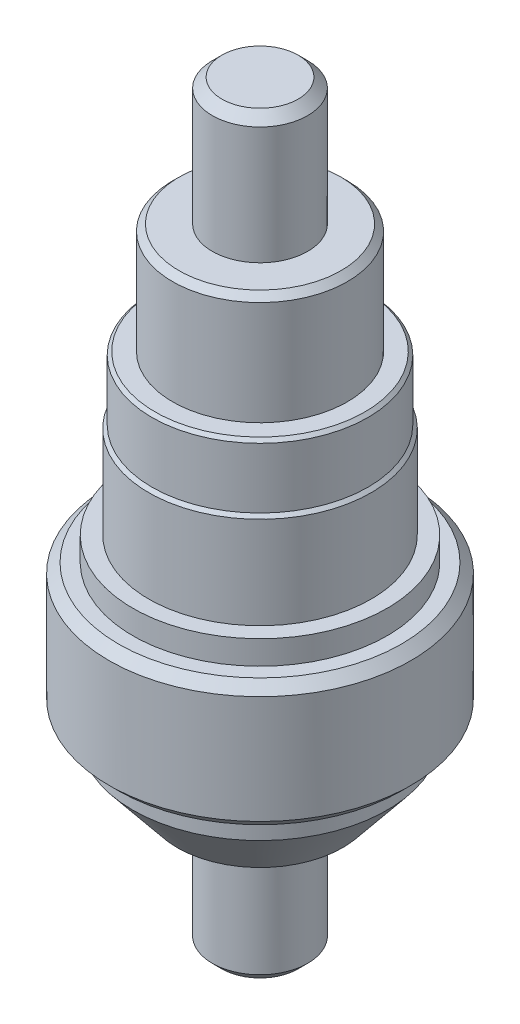
ISO-10303-21;
HEADER;
FILE_DESCRIPTION(('STEP AP214'),'2;1');
FILE_NAME('part.step','',(''),(''),'','','');
FILE_SCHEMA(('AUTOMOTIVE_DESIGN { 1 0 10303 214 1 1 1 1 }'));
ENDSEC;
DATA;
#1=APPLICATION_CONTEXT('core data for automotive mechanical design processes');
#2=APPLICATION_PROTOCOL_DEFINITION('international standard','automotive_design',2000,#1);
#3=PRODUCT_CONTEXT('',#1,'mechanical');
#4=PRODUCT('Part','Part','',(#3));
#5=PRODUCT_RELATED_PRODUCT_CATEGORY('part','',(#4));
#6=PRODUCT_DEFINITION_FORMATION('','',#4);
#7=PRODUCT_DEFINITION_CONTEXT('part definition',#1,'design');
#8=PRODUCT_DEFINITION('design','',#6,#7);
#9=PRODUCT_DEFINITION_SHAPE('','',#8);
#10=(LENGTH_UNIT() NAMED_UNIT(*) SI_UNIT(.MILLI.,.METRE.));
#11=(NAMED_UNIT(*) PLANE_ANGLE_UNIT() SI_UNIT($,.RADIAN.));
#12=(NAMED_UNIT(*) SI_UNIT($,.STERADIAN.) SOLID_ANGLE_UNIT());
#13=UNCERTAINTY_MEASURE_WITH_UNIT(LENGTH_MEASURE(1.E-05),#10,'distance_accuracy_value','');
#14=(GEOMETRIC_REPRESENTATION_CONTEXT(3) GLOBAL_UNCERTAINTY_ASSIGNED_CONTEXT((#13)) GLOBAL_UNIT_ASSIGNED_CONTEXT((#10,
#11,#12)) REPRESENTATION_CONTEXT('',''));
#15=CARTESIAN_POINT('',(0.,0.,0.));
#16=DIRECTION('',(0.,0.,1.));
#17=DIRECTION('',(1.,0.,0.));
#18=AXIS2_PLACEMENT_3D('',#15,#16,#17);
#19=CARTESIAN_POINT('',(1.50000000000001,15.225,0.));
#20=DIRECTION('',(0.,1.,0.));
#21=DIRECTION('',(0.,0.,1.));
#22=AXIS2_PLACEMENT_3D('',#19,#20,#21);
#23=PLANE('',#22);
#24=CARTESIAN_POINT('',(0.,15.2249999999867,0.));
#25=DIRECTION('',(0.,-1.,0.));
#26=DIRECTION('',(0.,0.,-1.));
#27=AXIS2_PLACEMENT_3D('',#24,#25,#26);
#28=CIRCLE('',#27,1.20000000003984);
#29=CARTESIAN_POINT('',(0.,15.2249999999867,-1.20000000003984));
#30=VERTEX_POINT('',#29);
#31=EDGE_CURVE('E17',#30,#30,#28,.T.);
#32=ORIENTED_EDGE('',*,*,#31,.F.);
#33=EDGE_LOOP('',(#32));
#34=FACE_BOUND('',#33,.T.);
#35=ADVANCED_FACE('F14',(#34),#23,.T.);
#36=CARTESIAN_POINT('',(0.,14.925000000062,0.));
#37=DIRECTION('',(0.,-1.,0.));
#38=DIRECTION('',(0.,0.,-1.));
#39=AXIS2_PLACEMENT_3D('',#36,#37,#38);
#40=CONICAL_SURFACE('',#39,1.49999999996453,0.785398163397448);
#41=ORIENTED_EDGE('',*,*,#31,.T.);
#42=EDGE_LOOP('',(#41));
#43=FACE_BOUND('',#42,.T.);
#44=CARTESIAN_POINT('',(0.,14.925,0.));
#45=DIRECTION('',(0.,-1.,0.));
#46=DIRECTION('',(0.,0.,-1.));
#47=AXIS2_PLACEMENT_3D('',#44,#45,#46);
#48=CIRCLE('',#47,1.50000000000002);
#49=CARTESIAN_POINT('',(0.,14.925,-1.50000000000002));
#50=VERTEX_POINT('',#49);
#51=EDGE_CURVE('E64',#50,#50,#48,.T.);
#52=ORIENTED_EDGE('',*,*,#51,.F.);
#53=EDGE_LOOP('',(#52));
#54=FACE_BOUND('',#53,.T.);
#55=ADVANCED_FACE('F116',(#43,#54),#40,.T.);
#56=CARTESIAN_POINT('',(0.,13.225,0.));
#57=DIRECTION('',(0.,-1.,0.));
#58=DIRECTION('',(0.,0.,-1.));
#59=AXIS2_PLACEMENT_3D('',#56,#57,#58);
#60=CYLINDRICAL_SURFACE('',#59,1.50000000000002);
#61=ORIENTED_EDGE('',*,*,#51,.T.);
#62=EDGE_LOOP('',(#61));
#63=FACE_BOUND('',#62,.T.);
#64=CARTESIAN_POINT('',(0.,11.225,0.));
#65=DIRECTION('',(0.,-1.,0.));
#66=DIRECTION('',(0.,0.,-1.));
#67=AXIS2_PLACEMENT_3D('',#64,#65,#66);
#68=CIRCLE('',#67,1.50000000000002);
#69=CARTESIAN_POINT('',(0.,11.225,-1.50000000000002));
#70=VERTEX_POINT('',#69);
#71=EDGE_CURVE('E68',#70,#70,#68,.T.);
#72=ORIENTED_EDGE('',*,*,#71,.F.);
#73=EDGE_LOOP('',(#72));
#74=FACE_BOUND('',#73,.T.);
#75=ADVANCED_FACE('F114',(#63,#74),#60,.T.);
#76=CARTESIAN_POINT('',(2.75000000000001,11.225,0.));
#77=DIRECTION('',(0.,1.,0.));
#78=DIRECTION('',(0.,0.,1.));
#79=AXIS2_PLACEMENT_3D('',#76,#77,#78);
#80=PLANE('',#79);
#81=ORIENTED_EDGE('',*,*,#71,.T.);
#82=EDGE_LOOP('',(#81));
#83=FACE_BOUND('',#82,.T.);
#84=CARTESIAN_POINT('',(0.,11.2250000000245,0.));
#85=DIRECTION('',(0.,-1.,0.));
#86=DIRECTION('',(0.,0.,-1.));
#87=AXIS2_PLACEMENT_3D('',#84,#85,#86);
#88=CIRCLE('',#87,2.55000000009886);
#89=CARTESIAN_POINT('',(0.,11.2250000000245,-2.55000000009886));
#90=VERTEX_POINT('',#89);
#91=EDGE_CURVE('E63',#90,#90,#88,.T.);
#92=ORIENTED_EDGE('',*,*,#91,.F.);
#93=EDGE_LOOP('',(#92));
#94=FACE_BOUND('',#93,.T.);
#95=ADVANCED_FACE('F111',(#83,#94),#80,.T.);
#96=CARTESIAN_POINT('',(0.,11.0250000000747,0.));
#97=DIRECTION('',(0.,-1.,0.));
#98=DIRECTION('',(0.,0.,-1.));
#99=AXIS2_PLACEMENT_3D('',#96,#97,#98);
#100=CONICAL_SURFACE('',#99,2.75000000004866,0.785398163397448);
#101=ORIENTED_EDGE('',*,*,#91,.T.);
#102=EDGE_LOOP('',(#101));
#103=FACE_BOUND('',#102,.T.);
#104=CARTESIAN_POINT('',(0.,11.025,0.));
#105=DIRECTION('',(0.,-1.,0.));
#106=DIRECTION('',(0.,0.,-1.));
#107=AXIS2_PLACEMENT_3D('',#104,#105,#106);
#108=CIRCLE('',#107,2.75000000000001);
#109=CARTESIAN_POINT('',(0.,11.025,-2.75000000000001));
#110=VERTEX_POINT('',#109);
#111=EDGE_CURVE('E58',#110,#110,#108,.T.);
#112=ORIENTED_EDGE('',*,*,#111,.F.);
#113=EDGE_LOOP('',(#112));
#114=FACE_BOUND('',#113,.T.);
#115=ADVANCED_FACE('F124',(#103,#114),#100,.T.);
#116=CARTESIAN_POINT('',(0.,9.4875,0.));
#117=DIRECTION('',(0.,-1.,0.));
#118=DIRECTION('',(0.,0.,-1.));
#119=AXIS2_PLACEMENT_3D('',#116,#117,#118);
#120=CYLINDRICAL_SURFACE('',#119,2.75000000000001);
#121=ORIENTED_EDGE('',*,*,#111,.T.);
#122=EDGE_LOOP('',(#121));
#123=FACE_BOUND('',#122,.T.);
#124=CARTESIAN_POINT('',(0.,7.75,0.));
#125=DIRECTION('',(0.,-1.,0.));
#126=DIRECTION('',(0.,0.,-1.));
#127=AXIS2_PLACEMENT_3D('',#124,#125,#126);
#128=CIRCLE('',#127,2.75000000000001);
#129=CARTESIAN_POINT('',(0.,7.75,-2.75000000000001));
#130=VERTEX_POINT('',#129);
#131=EDGE_CURVE('E62',#130,#130,#128,.T.);
#132=ORIENTED_EDGE('',*,*,#131,.F.);
#133=EDGE_LOOP('',(#132));
#134=FACE_BOUND('',#133,.T.);
#135=ADVANCED_FACE('F201',(#123,#134),#120,.T.);
#136=CARTESIAN_POINT('',(3.4,7.75,0.));
#137=DIRECTION('',(0.,1.,0.));
#138=DIRECTION('',(0.,0.,1.));
#139=AXIS2_PLACEMENT_3D('',#136,#137,#138);
#140=PLANE('',#139);
#141=ORIENTED_EDGE('',*,*,#131,.T.);
#142=EDGE_LOOP('',(#141));
#143=FACE_BOUND('',#142,.T.);
#144=CARTESIAN_POINT('',(0.,7.75000000004411,0.));
#145=DIRECTION('',(0.,-1.,0.));
#146=DIRECTION('',(0.,0.,-1.));
#147=AXIS2_PLACEMENT_3D('',#144,#145,#146);
#148=CIRCLE('',#147,3.30000000008113);
#149=CARTESIAN_POINT('',(0.,7.75000000004411,-3.30000000008113));
#150=VERTEX_POINT('',#149);
#151=EDGE_CURVE('E57',#150,#150,#148,.T.);
#152=ORIENTED_EDGE('',*,*,#151,.F.);
#153=EDGE_LOOP('',(#152));
#154=FACE_BOUND('',#153,.T.);
#155=ADVANCED_FACE('F197',(#143,#154),#140,.T.);
#156=CARTESIAN_POINT('',(0.,7.65000000001237,0.));
#157=DIRECTION('',(0.,-1.,0.));
#158=DIRECTION('',(0.,0.,-1.));
#159=AXIS2_PLACEMENT_3D('',#156,#157,#158);
#160=CONICAL_SURFACE('',#159,3.40000000011287,0.785398163397448);
#161=ORIENTED_EDGE('',*,*,#151,.T.);
#162=EDGE_LOOP('',(#161));
#163=FACE_BOUND('',#162,.T.);
#164=CARTESIAN_POINT('',(0.,7.65,0.));
#165=DIRECTION('',(0.,-1.,0.));
#166=DIRECTION('',(0.,0.,-1.));
#167=AXIS2_PLACEMENT_3D('',#164,#165,#166);
#168=CIRCLE('',#167,3.4);
#169=CARTESIAN_POINT('',(0.,7.65,-3.4));
#170=VERTEX_POINT('',#169);
#171=EDGE_CURVE('E53',#170,#170,#168,.T.);
#172=ORIENTED_EDGE('',*,*,#171,.F.);
#173=EDGE_LOOP('',(#172));
#174=FACE_BOUND('',#173,.T.);
#175=ADVANCED_FACE('F193',(#163,#174),#160,.T.);
#176=CARTESIAN_POINT('',(0.,-8.475,0.));
#177=DIRECTION('',(0.,-1.,0.));
#178=DIRECTION('',(0.,0.,-1.));
#179=AXIS2_PLACEMENT_3D('',#176,#177,#178);
#180=PLANE('',#179);
#181=CARTESIAN_POINT('',(0.,-8.47500000008949,0.));
#182=DIRECTION('',(0.,1.,0.));
#183=DIRECTION('',(0.,0.,1.));
#184=AXIS2_PLACEMENT_3D('',#181,#182,#183);
#185=CIRCLE('',#184,1.19999999992615);
#186=CARTESIAN_POINT('',(0.,-8.47500000008949,1.19999999992615));
#187=VERTEX_POINT('',#186);
#188=EDGE_CURVE('E52',#187,#187,#185,.T.);
#189=ORIENTED_EDGE('',*,*,#188,.F.);
#190=EDGE_LOOP('',(#189));
#191=FACE_BOUND('',#190,.T.);
#192=ADVANCED_FACE('F189',(#191),#180,.T.);
#193=CARTESIAN_POINT('',(0.,6.75,0.));
#194=DIRECTION('',(0.,-1.,0.));
#195=DIRECTION('',(0.,0.,-1.));
#196=AXIS2_PLACEMENT_3D('',#193,#194,#195);
#197=CYLINDRICAL_SURFACE('',#196,3.4);
#198=ORIENTED_EDGE('',*,*,#171,.T.);
#199=EDGE_LOOP('',(#198));
#200=FACE_BOUND('',#199,.T.);
#201=CARTESIAN_POINT('',(0.,5.74999999997772,0.));
#202=DIRECTION('',(0.,-1.,0.));
#203=DIRECTION('',(0.,0.,-1.));
#204=AXIS2_PLACEMENT_3D('',#201,#202,#203);
#205=CIRCLE('',#204,3.39999999994234);
#206=CARTESIAN_POINT('',(0.,5.74999999997772,-3.39999999994234));
#207=VERTEX_POINT('',#206);
#208=EDGE_CURVE('E48',#207,#207,#205,.T.);
#209=ORIENTED_EDGE('',*,*,#208,.F.);
#210=EDGE_LOOP('',(#209));
#211=FACE_BOUND('',#210,.T.);
#212=ADVANCED_FACE('F185',(#200,#211),#197,.T.);
#213=CARTESIAN_POINT('',(0.,-8.17500000010796,0.));
#214=DIRECTION('',(0.,1.,0.));
#215=DIRECTION('',(0.,0.,1.));
#216=AXIS2_PLACEMENT_3D('',#213,#214,#215);
#217=CONICAL_SURFACE('',#216,1.49999999990769,0.785398163397448);
#218=CARTESIAN_POINT('',(0.,-8.17500000000001,0.));
#219=DIRECTION('',(0.,-1.,0.));
#220=DIRECTION('',(0.,0.,-1.));
#221=AXIS2_PLACEMENT_3D('',#218,#219,#220);
#222=CIRCLE('',#221,1.5);
#223=CARTESIAN_POINT('',(0.,-8.17500000000001,-1.5));
#224=VERTEX_POINT('',#223);
#225=EDGE_CURVE('E44',#224,#224,#222,.F.);
#226=ORIENTED_EDGE('',*,*,#225,.F.);
#227=EDGE_LOOP('',(#226));
#228=FACE_BOUND('',#227,.T.);
#229=ORIENTED_EDGE('',*,*,#188,.T.);
#230=EDGE_LOOP('',(#229));
#231=FACE_BOUND('',#230,.T.);
#232=ADVANCED_FACE('F181',(#228,#231),#217,.T.);
#233=CARTESIAN_POINT('',(0.,5.65000000011651,0.));
#234=DIRECTION('',(0.,-1.,0.));
#235=DIRECTION('',(0.,0.,-1.));
#236=AXIS2_PLACEMENT_3D('',#233,#234,#235);
#237=CONICAL_SURFACE('',#236,3.49999999997408,0.7853981642501);
#238=ORIENTED_EDGE('',*,*,#208,.T.);
#239=EDGE_LOOP('',(#238));
#240=FACE_BOUND('',#239,.T.);
#241=CARTESIAN_POINT('',(0.,5.65,0.));
#242=DIRECTION('',(0.,-1.,0.));
#243=DIRECTION('',(0.,0.,-1.));
#244=AXIS2_PLACEMENT_3D('',#241,#242,#243);
#245=CIRCLE('',#244,3.5);
#246=CARTESIAN_POINT('',(0.,5.65,-3.5));
#247=VERTEX_POINT('',#246);
#248=EDGE_CURVE('E39',#247,#247,#245,.T.);
#249=ORIENTED_EDGE('',*,*,#248,.F.);
#250=EDGE_LOOP('',(#249));
#251=FACE_BOUND('',#250,.T.);
#252=ADVANCED_FACE('F177',(#240,#251),#237,.T.);
#253=CARTESIAN_POINT('',(0.,-6.475,0.));
#254=DIRECTION('',(0.,-1.,0.));
#255=DIRECTION('',(0.,0.,-1.));
#256=AXIS2_PLACEMENT_3D('',#253,#254,#255);
#257=CYLINDRICAL_SURFACE('',#256,1.5);
#258=ORIENTED_EDGE('',*,*,#225,.T.);
#259=EDGE_LOOP('',(#258));
#260=FACE_BOUND('',#259,.T.);
#261=CARTESIAN_POINT('',(0.,-4.475,0.));
#262=DIRECTION('',(0.,-1.,0.));
#263=DIRECTION('',(0.,0.,-1.));
#264=AXIS2_PLACEMENT_3D('',#261,#262,#263);
#265=CIRCLE('',#264,1.5);
#266=CARTESIAN_POINT('',(0.,-4.475,-1.5));
#267=VERTEX_POINT('',#266);
#268=EDGE_CURVE('E43',#267,#267,#265,.F.);
#269=ORIENTED_EDGE('',*,*,#268,.F.);
#270=EDGE_LOOP('',(#269));
#271=FACE_BOUND('',#270,.T.);
#272=ADVANCED_FACE('F173',(#260,#271),#257,.T.);
#273=CARTESIAN_POINT('',(0.,4.25,0.));
#274=DIRECTION('',(0.,-1.,0.));
#275=DIRECTION('',(0.,0.,-1.));
#276=AXIS2_PLACEMENT_3D('',#273,#274,#275);
#277=CYLINDRICAL_SURFACE('',#276,3.5);
#278=ORIENTED_EDGE('',*,*,#248,.T.);
#279=EDGE_LOOP('',(#278));
#280=FACE_BOUND('',#279,.T.);
#281=CARTESIAN_POINT('',(0.,2.75,0.));
#282=DIRECTION('',(0.,-1.,0.));
#283=DIRECTION('',(0.,0.,-1.));
#284=AXIS2_PLACEMENT_3D('',#281,#282,#283);
#285=CIRCLE('',#284,3.5);
#286=CARTESIAN_POINT('',(0.,2.75,-3.5));
#287=VERTEX_POINT('',#286);
#288=EDGE_CURVE('E89',#287,#287,#285,.T.);
#289=ORIENTED_EDGE('',*,*,#288,.F.);
#290=EDGE_LOOP('',(#289));
#291=FACE_BOUND('',#290,.T.);
#292=ADVANCED_FACE('F169',(#280,#291),#277,.T.);
#293=CARTESIAN_POINT('',(1.5,-4.475,0.));
#294=DIRECTION('',(0.,-1.,0.));
#295=DIRECTION('',(0.,0.,-1.));
#296=AXIS2_PLACEMENT_3D('',#293,#294,#295);
#297=PLANE('',#296);
#298=ORIENTED_EDGE('',*,*,#268,.T.);
#299=EDGE_LOOP('',(#298));
#300=FACE_BOUND('',#299,.T.);
#301=CARTESIAN_POINT('',(0.,-4.47499999995671,0.));
#302=DIRECTION('',(0.,1.,0.));
#303=DIRECTION('',(0.,0.,1.));
#304=AXIS2_PLACEMENT_3D('',#301,#302,#303);
#305=CIRCLE('',#304,2.59999999997262);
#306=CARTESIAN_POINT('',(0.,-4.47499999995671,2.59999999997262));
#307=VERTEX_POINT('',#306);
#308=EDGE_CURVE('E85',#307,#307,#305,.T.);
#309=ORIENTED_EDGE('',*,*,#308,.F.);
#310=EDGE_LOOP('',(#309));
#311=FACE_BOUND('',#310,.T.);
#312=ADVANCED_FACE('F165',(#300,#311),#297,.T.);
#313=CARTESIAN_POINT('',(4.,2.75,0.));
#314=DIRECTION('',(0.,1.,0.));
#315=DIRECTION('',(0.,0.,1.));
#316=AXIS2_PLACEMENT_3D('',#313,#314,#315);
#317=PLANE('',#316);
#318=ORIENTED_EDGE('',*,*,#288,.T.);
#319=EDGE_LOOP('',(#318));
#320=FACE_BOUND('',#319,.T.);
#321=CARTESIAN_POINT('',(0.,2.75,0.));
#322=DIRECTION('',(0.,-1.,0.));
#323=DIRECTION('',(0.,0.,-1.));
#324=AXIS2_PLACEMENT_3D('',#321,#322,#323);
#325=CIRCLE('',#324,4.);
#326=CARTESIAN_POINT('',(0.,2.75,-4.));
#327=VERTEX_POINT('',#326);
#328=EDGE_CURVE('E38',#327,#327,#325,.T.);
#329=ORIENTED_EDGE('',*,*,#328,.F.);
#330=EDGE_LOOP('',(#329));
#331=FACE_BOUND('',#330,.T.);
#332=ADVANCED_FACE('F161',(#320,#331),#317,.T.);
#333=CARTESIAN_POINT('',(0.,-2.74999999999181,0.));
#334=DIRECTION('',(0.,1.,0.));
#335=DIRECTION('',(0.,0.,1.));
#336=AXIS2_PLACEMENT_3D('',#333,#334,#335);
#337=CONICAL_SURFACE('',#336,3.99999999996226,0.681770703406911);
#338=CARTESIAN_POINT('',(0.,-2.75,0.));
#339=DIRECTION('',(0.,-1.,0.));
#340=DIRECTION('',(0.,0.,-1.));
#341=AXIS2_PLACEMENT_3D('',#338,#339,#340);
#342=CIRCLE('',#341,4.);
#343=CARTESIAN_POINT('',(0.,-2.75,-4.));
#344=VERTEX_POINT('',#343);
#345=EDGE_CURVE('E33',#344,#344,#342,.F.);
#346=ORIENTED_EDGE('',*,*,#345,.F.);
#347=EDGE_LOOP('',(#346));
#348=FACE_BOUND('',#347,.T.);
#349=ORIENTED_EDGE('',*,*,#308,.T.);
#350=EDGE_LOOP('',(#349));
#351=FACE_BOUND('',#350,.T.);
#352=ADVANCED_FACE('F157',(#348,#351),#337,.T.);
#353=CARTESIAN_POINT('',(0.,2.375,0.));
#354=DIRECTION('',(0.,-1.,0.));
#355=DIRECTION('',(0.,0.,-1.));
#356=AXIS2_PLACEMENT_3D('',#353,#354,#355);
#357=CYLINDRICAL_SURFACE('',#356,4.);
#358=ORIENTED_EDGE('',*,*,#328,.T.);
#359=EDGE_LOOP('',(#358));
#360=FACE_BOUND('',#359,.T.);
#361=CARTESIAN_POINT('',(0.,2.,0.));
#362=DIRECTION('',(0.,-1.,0.));
#363=DIRECTION('',(0.,0.,-1.));
#364=AXIS2_PLACEMENT_3D('',#361,#362,#363);
#365=CIRCLE('',#364,4.);
#366=CARTESIAN_POINT('',(0.,2.,-4.));
#367=VERTEX_POINT('',#366);
#368=EDGE_CURVE('E37',#367,#367,#365,.T.);
#369=ORIENTED_EDGE('',*,*,#368,.F.);
#370=EDGE_LOOP('',(#369));
#371=FACE_BOUND('',#370,.T.);
#372=ADVANCED_FACE('F153',(#360,#371),#357,.T.);
#373=CARTESIAN_POINT('',(0.,-2.375,0.));
#374=DIRECTION('',(0.,-1.,0.));
#375=DIRECTION('',(0.,0.,-1.));
#376=AXIS2_PLACEMENT_3D('',#373,#374,#375);
#377=CYLINDRICAL_SURFACE('',#376,4.);
#378=ORIENTED_EDGE('',*,*,#345,.T.);
#379=EDGE_LOOP('',(#378));
#380=FACE_BOUND('',#379,.T.);
#381=CARTESIAN_POINT('',(0.,-2.,0.));
#382=DIRECTION('',(0.,-1.,0.));
#383=DIRECTION('',(0.,0.,-1.));
#384=AXIS2_PLACEMENT_3D('',#381,#382,#383);
#385=CIRCLE('',#384,4.);
#386=CARTESIAN_POINT('',(0.,-2.,-4.));
#387=VERTEX_POINT('',#386);
#388=EDGE_CURVE('E75',#387,#387,#385,.F.);
#389=ORIENTED_EDGE('',*,*,#388,.F.);
#390=EDGE_LOOP('',(#389));
#391=FACE_BOUND('',#390,.T.);
#392=ADVANCED_FACE('F149',(#380,#391),#377,.T.);
#393=CARTESIAN_POINT('',(4.75,2.,0.));
#394=DIRECTION('',(0.,1.,0.));
#395=DIRECTION('',(0.,0.,1.));
#396=AXIS2_PLACEMENT_3D('',#393,#394,#395);
#397=PLANE('',#396);
#398=ORIENTED_EDGE('',*,*,#368,.T.);
#399=EDGE_LOOP('',(#398));
#400=FACE_BOUND('',#399,.T.);
#401=CARTESIAN_POINT('',(0.,1.99999999995271,0.));
#402=DIRECTION('',(0.,-1.,0.));
#403=DIRECTION('',(0.,0.,-1.));
#404=AXIS2_PLACEMENT_3D('',#401,#402,#403);
#405=CIRCLE('',#404,4.45000000001983);
#406=CARTESIAN_POINT('',(0.,1.99999999995271,-4.45000000001983));
#407=VERTEX_POINT('',#406);
#408=EDGE_CURVE('E71',#407,#407,#405,.T.);
#409=ORIENTED_EDGE('',*,*,#408,.F.);
#410=EDGE_LOOP('',(#409));
#411=FACE_BOUND('',#410,.T.);
#412=ADVANCED_FACE('F145',(#400,#411),#397,.T.);
#413=CARTESIAN_POINT('',(4.,-2.,0.));
#414=DIRECTION('',(0.,-1.,0.));
#415=DIRECTION('',(0.,0.,-1.));
#416=AXIS2_PLACEMENT_3D('',#413,#414,#415);
#417=PLANE('',#416);
#418=ORIENTED_EDGE('',*,*,#388,.T.);
#419=EDGE_LOOP('',(#418));
#420=FACE_BOUND('',#419,.T.);
#421=CARTESIAN_POINT('',(0.,-2.00000000006639,0.));
#422=DIRECTION('',(0.,1.,0.));
#423=DIRECTION('',(-1.,0.,0.));
#424=AXIS2_PLACEMENT_3D('',#421,#422,#423);
#425=CIRCLE('',#424,4.44999999996298);
#426=CARTESIAN_POINT('',(-4.44999999996298,-2.00000000006639,0.));
#427=VERTEX_POINT('',#426);
#428=EDGE_CURVE('E30',#427,#427,#425,.T.);
#429=ORIENTED_EDGE('',*,*,#428,.F.);
#430=EDGE_LOOP('',(#429));
#431=FACE_BOUND('',#430,.T.);
#432=ADVANCED_FACE('F141',(#420,#431),#417,.T.);
#433=CARTESIAN_POINT('',(0.,1.6999999992322,0.));
#434=DIRECTION('',(0.,-1.,0.));
#435=DIRECTION('',(0.,0.,-1.));
#436=AXIS2_PLACEMENT_3D('',#433,#434,#435);
#437=CONICAL_SURFACE('',#436,4.75000000074033,0.785398163397448);
#438=CARTESIAN_POINT('',(0.,1.69999999917536,0.));
#439=DIRECTION('',(0.,-1.,0.));
#440=DIRECTION('',(0.,0.,-1.));
#441=AXIS2_PLACEMENT_3D('',#438,#439,#440);
#442=CIRCLE('',#441,4.75);
#443=CARTESIAN_POINT('',(0.,1.69999999917536,-4.75));
#444=VERTEX_POINT('',#443);
#445=EDGE_CURVE('E22',#444,#444,#442,.T.);
#446=ORIENTED_EDGE('',*,*,#445,.F.);
#447=EDGE_LOOP('',(#446));
#448=FACE_BOUND('',#447,.T.);
#449=ORIENTED_EDGE('',*,*,#408,.T.);
#450=EDGE_LOOP('',(#449));
#451=FACE_BOUND('',#450,.T.);
#452=ADVANCED_FACE('F134',(#448,#451),#437,.T.);
#453=CARTESIAN_POINT('',(0.,-1.70000000002801,0.));
#454=DIRECTION('',(0.,1.,0.));
#455=DIRECTION('',(-1.,0.,0.));
#456=AXIS2_PLACEMENT_3D('',#453,#454,#455);
#457=CONICAL_SURFACE('',#456,4.75000000000136,0.785398163397448);
#458=CARTESIAN_POINT('',(0.,-1.7,0.));
#459=DIRECTION('',(0.,-1.,0.));
#460=DIRECTION('',(0.,0.,-1.));
#461=AXIS2_PLACEMENT_3D('',#458,#459,#460);
#462=CIRCLE('',#461,4.75);
#463=CARTESIAN_POINT('',(0.,-1.7,-4.75));
#464=VERTEX_POINT('',#463);
#465=EDGE_CURVE('E10',#464,#464,#462,.F.);
#466=ORIENTED_EDGE('',*,*,#465,.F.);
#467=EDGE_LOOP('',(#466));
#468=FACE_BOUND('',#467,.T.);
#469=ORIENTED_EDGE('',*,*,#428,.T.);
#470=EDGE_LOOP('',(#469));
#471=FACE_BOUND('',#470,.T.);
#472=ADVANCED_FACE('F129',(#468,#471),#457,.T.);
#473=CARTESIAN_POINT('',(0.,0.,0.));
#474=DIRECTION('',(0.,-1.,0.));
#475=DIRECTION('',(0.,0.,-1.));
#476=AXIS2_PLACEMENT_3D('',#473,#474,#475);
#477=CYLINDRICAL_SURFACE('',#476,4.75);
#478=ORIENTED_EDGE('',*,*,#465,.T.);
#479=EDGE_LOOP('',(#478));
#480=FACE_BOUND('',#479,.T.);
#481=ORIENTED_EDGE('',*,*,#445,.T.);
#482=EDGE_LOOP('',(#481));
#483=FACE_BOUND('',#482,.T.);
#484=ADVANCED_FACE('F127',(#480,#483),#477,.T.);
#485=CLOSED_SHELL('',(#35,#55,#75,#95,#115,#135,#155,#175,#192,#212,#232,#252,#272,#292,#312,
#332,#352,#372,#392,#412,#432,#452,#472,#484));
#486=MANIFOLD_SOLID_BREP('B1',#485);
#487=ADVANCED_BREP_SHAPE_REPRESENTATION('',(#18,#486),#14);
#488=SHAPE_DEFINITION_REPRESENTATION(#9,#487);
ENDSEC;
END-ISO-10303-21;
